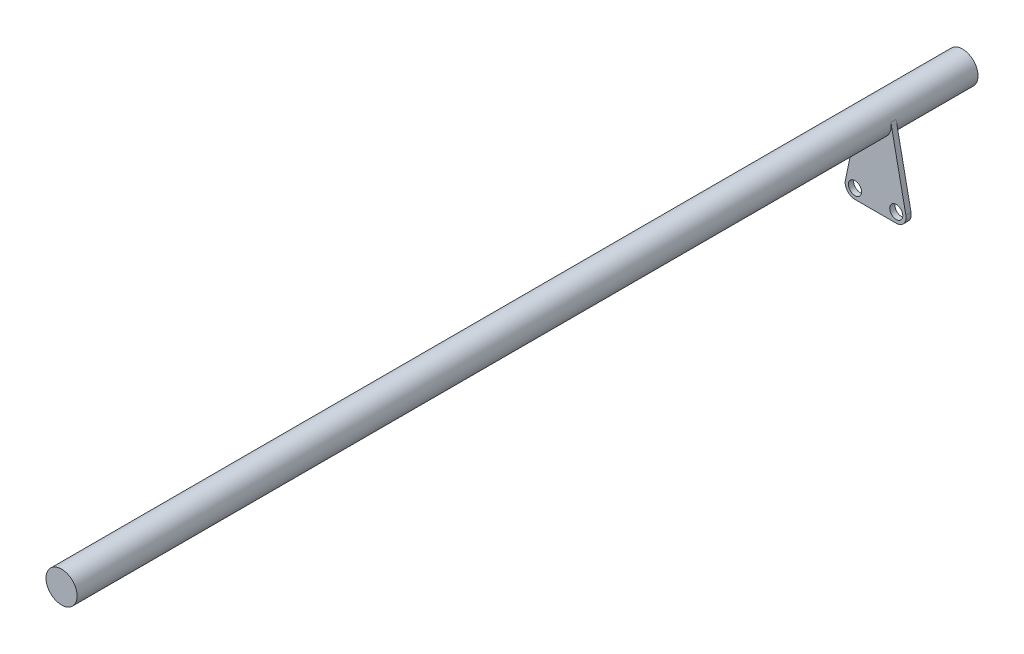
ISO-10303-21;
HEADER;
FILE_DESCRIPTION(('STEP AP214'),'2;1');
FILE_NAME('part.step','',(''),(''),'','','');
FILE_SCHEMA(('AUTOMOTIVE_DESIGN { 1 0 10303 214 1 1 1 1 }'));
ENDSEC;
DATA;
#1=APPLICATION_CONTEXT('core data for automotive mechanical design processes');
#2=APPLICATION_PROTOCOL_DEFINITION('international standard','automotive_design',2000,#1);
#3=PRODUCT_CONTEXT('',#1,'mechanical');
#4=PRODUCT('Part','Part','',(#3));
#5=PRODUCT_RELATED_PRODUCT_CATEGORY('part','',(#4));
#6=PRODUCT_DEFINITION_FORMATION('','',#4);
#7=PRODUCT_DEFINITION_CONTEXT('part definition',#1,'design');
#8=PRODUCT_DEFINITION('design','',#6,#7);
#9=PRODUCT_DEFINITION_SHAPE('','',#8);
#10=(LENGTH_UNIT() NAMED_UNIT(*) SI_UNIT(.MILLI.,.METRE.));
#11=(NAMED_UNIT(*) PLANE_ANGLE_UNIT() SI_UNIT($,.RADIAN.));
#12=(NAMED_UNIT(*) SI_UNIT($,.STERADIAN.) SOLID_ANGLE_UNIT());
#13=UNCERTAINTY_MEASURE_WITH_UNIT(LENGTH_MEASURE(1.E-05),#10,'distance_accuracy_value','');
#14=(GEOMETRIC_REPRESENTATION_CONTEXT(3) GLOBAL_UNCERTAINTY_ASSIGNED_CONTEXT((#13)) GLOBAL_UNIT_ASSIGNED_CONTEXT((#10,
#11,#12)) REPRESENTATION_CONTEXT('',''));
#15=CARTESIAN_POINT('',(0.,0.,0.));
#16=DIRECTION('',(0.,0.,1.));
#17=DIRECTION('',(1.,0.,0.));
#18=AXIS2_PLACEMENT_3D('',#15,#16,#17);
#19=CARTESIAN_POINT('',(0.,0.,250.));
#20=DIRECTION('',(0.,0.,-1.));
#21=DIRECTION('',(-1.,0.,0.));
#22=AXIS2_PLACEMENT_3D('',#19,#20,#21);
#23=CYLINDRICAL_SURFACE('',#22,9.525);
#24=DIRECTION('',(0.,0.,1.));
#25=VECTOR('',#24,1.);
#26=CARTESIAN_POINT('',(-9.32999835036764,1.91748684014706,-251.5875));
#27=LINE('',#26,#25);
#28=CARTESIAN_POINT('',(-9.32999835036764,1.91748684014706,-251.5875));
#29=VERTEX_POINT('',#28);
#30=CARTESIAN_POINT('',(-9.32999835036764,1.91748684014706,-248.4125));
#31=VERTEX_POINT('',#30);
#32=EDGE_CURVE('E86',#29,#31,#27,.T.);
#33=ORIENTED_EDGE('',*,*,#32,.T.);
#34=CARTESIAN_POINT('',(0.,0.,-248.4125));
#35=DIRECTION('',(0.,0.,-1.));
#36=DIRECTION('',(-1.,0.,0.));
#37=AXIS2_PLACEMENT_3D('',#34,#35,#36);
#38=CIRCLE('',#37,9.525);
#39=CARTESIAN_POINT('',(9.32999835036764,1.91748684014706,-248.4125));
#40=VERTEX_POINT('',#39);
#41=EDGE_CURVE('E42',#40,#31,#38,.T.);
#42=ORIENTED_EDGE('',*,*,#41,.F.);
#43=DIRECTION('',(0.,0.,1.));
#44=VECTOR('',#43,1.);
#45=CARTESIAN_POINT('',(9.32999835036764,1.91748684014706,-251.5875));
#46=LINE('',#45,#44);
#47=CARTESIAN_POINT('',(9.32999835036764,1.91748684014706,-251.5875));
#48=VERTEX_POINT('',#47);
#49=EDGE_CURVE('E141',#48,#40,#46,.T.);
#50=ORIENTED_EDGE('',*,*,#49,.F.);
#51=CARTESIAN_POINT('',(0.,0.,-251.5875));
#52=DIRECTION('',(0.,0.,-1.));
#53=DIRECTION('',(-1.,0.,0.));
#54=AXIS2_PLACEMENT_3D('',#51,#52,#53);
#55=CIRCLE('',#54,9.525);
#56=EDGE_CURVE('E11',#48,#29,#55,.T.);
#57=ORIENTED_EDGE('',*,*,#56,.T.);
#58=EDGE_LOOP('',(#33,#42,#50,#57));
#59=FACE_BOUND('',#58,.T.);
#60=CARTESIAN_POINT('',(0.,0.,250.));
#61=DIRECTION('',(0.,0.,1.));
#62=DIRECTION('',(1.,0.,0.));
#63=AXIS2_PLACEMENT_3D('',#60,#61,#62);
#64=CIRCLE('',#63,9.525);
#65=CARTESIAN_POINT('',(9.525,0.,250.));
#66=VERTEX_POINT('',#65);
#67=EDGE_CURVE('E142',#66,#66,#64,.T.);
#68=ORIENTED_EDGE('',*,*,#67,.F.);
#69=EDGE_LOOP('',(#68));
#70=FACE_BOUND('',#69,.T.);
#71=CARTESIAN_POINT('',(0.,0.,-301.5875));
#72=DIRECTION('',(0.,0.,-1.));
#73=DIRECTION('',(-1.,0.,0.));
#74=AXIS2_PLACEMENT_3D('',#71,#72,#73);
#75=CIRCLE('',#74,9.525);
#76=CARTESIAN_POINT('',(-9.525,0.,-301.5875));
#77=VERTEX_POINT('',#76);
#78=EDGE_CURVE('E175',#77,#77,#75,.T.);
#79=ORIENTED_EDGE('',*,*,#78,.F.);
#80=EDGE_LOOP('',(#79));
#81=FACE_BOUND('',#80,.T.);
#82=ADVANCED_FACE('F39',(#59,#70,#81),#23,.T.);
#83=CARTESIAN_POINT('',(0.,0.,250.));
#84=DIRECTION('',(0.,0.,1.));
#85=DIRECTION('',(1.,0.,0.));
#86=AXIS2_PLACEMENT_3D('',#83,#84,#85);
#87=PLANE('',#86);
#88=ORIENTED_EDGE('',*,*,#67,.T.);
#89=EDGE_LOOP('',(#88));
#90=FACE_BOUND('',#89,.T.);
#91=ADVANCED_FACE('F164',(#90),#87,.T.);
#92=CARTESIAN_POINT('',(9.32999835036764,1.91748684014706,-251.5875));
#93=DIRECTION('',(-0.979527385865369,-0.201310954346148,0.));
#94=DIRECTION('',(0.201310954346148,-0.979527385865369,0.));
#95=AXIS2_PLACEMENT_3D('',#92,#93,#94);
#96=PLANE('',#95);
#97=DIRECTION('',(0.201310954346148,-0.979527385865369,0.));
#98=VECTOR('',#97,1.);
#99=CARTESIAN_POINT('',(9.32999835036764,1.91748684014706,-248.4125));
#100=LINE('',#99,#98);
#101=CARTESIAN_POINT('',(18.5186505767437,-42.7921342739231,-248.4125));
#102=VERTEX_POINT('',#101);
#103=EDGE_CURVE('E126',#40,#102,#100,.T.);
#104=ORIENTED_EDGE('',*,*,#103,.T.);
#105=DIRECTION('',(0.,0.,1.));
#106=VECTOR('',#105,1.);
#107=CARTESIAN_POINT('',(18.5186505767437,-42.7921342739231,-251.5875));
#108=LINE('',#107,#106);
#109=CARTESIAN_POINT('',(18.5186505767437,-42.7921342739231,-251.5875));
#110=VERTEX_POINT('',#109);
#111=EDGE_CURVE('E116',#110,#102,#108,.T.);
#112=ORIENTED_EDGE('',*,*,#111,.F.);
#113=DIRECTION('',(0.201310954346148,-0.979527385865369,0.));
#114=VECTOR('',#113,1.);
#115=CARTESIAN_POINT('',(9.32999835036764,1.91748684014706,-251.5875));
#116=LINE('',#115,#114);
#117=EDGE_CURVE('E104',#48,#110,#116,.T.);
#118=ORIENTED_EDGE('',*,*,#117,.F.);
#119=ORIENTED_EDGE('',*,*,#49,.T.);
#120=EDGE_LOOP('',(#104,#112,#118,#119));
#121=FACE_BOUND('',#120,.T.);
#122=ADVANCED_FACE('F170',(#121),#96,.F.);
#123=CARTESIAN_POINT('',(12.6414862615515,-44.,-251.5875));
#124=DIRECTION('',(0.,0.,1.));
#125=DIRECTION('',(1.,0.,0.));
#126=AXIS2_PLACEMENT_3D('',#123,#124,#125);
#127=CYLINDRICAL_SURFACE('',#126,6.);
#128=CARTESIAN_POINT('',(12.6414862615515,-44.,-248.4125));
#129=DIRECTION('',(0.,0.,-1.));
#130=DIRECTION('',(-1.,0.,0.));
#131=AXIS2_PLACEMENT_3D('',#128,#129,#130);
#132=CIRCLE('',#131,6.);
#133=CARTESIAN_POINT('',(12.6414862615515,-50.,-248.4125));
#134=VERTEX_POINT('',#133);
#135=EDGE_CURVE('E113',#102,#134,#132,.T.);
#136=ORIENTED_EDGE('',*,*,#135,.T.);
#137=DIRECTION('',(0.,0.,1.));
#138=VECTOR('',#137,1.);
#139=CARTESIAN_POINT('',(12.6414862615515,-50.,-251.5875));
#140=LINE('',#139,#138);
#141=CARTESIAN_POINT('',(12.6414862615515,-50.,-251.5875));
#142=VERTEX_POINT('',#141);
#143=EDGE_CURVE('E110',#142,#134,#140,.T.);
#144=ORIENTED_EDGE('',*,*,#143,.F.);
#145=CARTESIAN_POINT('',(12.6414862615515,-44.,-251.5875));
#146=DIRECTION('',(0.,0.,-1.));
#147=DIRECTION('',(-1.,0.,0.));
#148=AXIS2_PLACEMENT_3D('',#145,#146,#147);
#149=CIRCLE('',#148,6.);
#150=EDGE_CURVE('E97',#110,#142,#149,.T.);
#151=ORIENTED_EDGE('',*,*,#150,.F.);
#152=ORIENTED_EDGE('',*,*,#111,.T.);
#153=EDGE_LOOP('',(#136,#144,#151,#152));
#154=FACE_BOUND('',#153,.T.);
#155=ADVANCED_FACE('F111',(#154),#127,.T.);
#156=CARTESIAN_POINT('',(12.6414862615515,-50.,-251.5875));
#157=DIRECTION('',(0.,1.,0.));
#158=DIRECTION('',(0.,0.,1.));
#159=AXIS2_PLACEMENT_3D('',#156,#157,#158);
#160=PLANE('',#159);
#161=DIRECTION('',(-1.,0.,0.));
#162=VECTOR('',#161,1.);
#163=CARTESIAN_POINT('',(12.6414862615515,-50.,-248.4125));
#164=LINE('',#163,#162);
#165=CARTESIAN_POINT('',(-12.6414862615515,-50.,-248.4125));
#166=VERTEX_POINT('',#165);
#167=EDGE_CURVE('E130',#134,#166,#164,.T.);
#168=ORIENTED_EDGE('',*,*,#167,.T.);
#169=DIRECTION('',(0.,0.,1.));
#170=VECTOR('',#169,1.);
#171=CARTESIAN_POINT('',(-12.6414862615515,-50.,-251.5875));
#172=LINE('',#171,#170);
#173=CARTESIAN_POINT('',(-12.6414862615515,-50.,-251.5875));
#174=VERTEX_POINT('',#173);
#175=EDGE_CURVE('E117',#174,#166,#172,.T.);
#176=ORIENTED_EDGE('',*,*,#175,.F.);
#177=DIRECTION('',(-1.,0.,0.));
#178=VECTOR('',#177,1.);
#179=CARTESIAN_POINT('',(12.6414862615515,-50.,-251.5875));
#180=LINE('',#179,#178);
#181=EDGE_CURVE('E102',#142,#174,#180,.T.);
#182=ORIENTED_EDGE('',*,*,#181,.F.);
#183=ORIENTED_EDGE('',*,*,#143,.T.);
#184=EDGE_LOOP('',(#168,#176,#182,#183));
#185=FACE_BOUND('',#184,.T.);
#186=ADVANCED_FACE('F119',(#185),#160,.F.);
#187=CARTESIAN_POINT('',(-12.6414862615515,-44.,-251.5875));
#188=DIRECTION('',(0.,0.,1.));
#189=DIRECTION('',(1.,0.,0.));
#190=AXIS2_PLACEMENT_3D('',#187,#188,#189);
#191=CYLINDRICAL_SURFACE('',#190,6.);
#192=CARTESIAN_POINT('',(-12.6414862615515,-44.,-248.4125));
#193=DIRECTION('',(0.,0.,-1.));
#194=DIRECTION('',(-1.,0.,0.));
#195=AXIS2_PLACEMENT_3D('',#192,#193,#194);
#196=CIRCLE('',#195,6.);
#197=CARTESIAN_POINT('',(-18.5186505767437,-42.7921342739231,-248.4125));
#198=VERTEX_POINT('',#197);
#199=EDGE_CURVE('E79',#166,#198,#196,.T.);
#200=ORIENTED_EDGE('',*,*,#199,.T.);
#201=DIRECTION('',(0.,0.,1.));
#202=VECTOR('',#201,1.);
#203=CARTESIAN_POINT('',(-18.5186505767437,-42.7921342739231,-251.5875));
#204=LINE('',#203,#202);
#205=CARTESIAN_POINT('',(-18.5186505767437,-42.7921342739231,-251.5875));
#206=VERTEX_POINT('',#205);
#207=EDGE_CURVE('E137',#206,#198,#204,.T.);
#208=ORIENTED_EDGE('',*,*,#207,.F.);
#209=CARTESIAN_POINT('',(-12.6414862615515,-44.,-251.5875));
#210=DIRECTION('',(0.,0.,-1.));
#211=DIRECTION('',(-1.,0.,0.));
#212=AXIS2_PLACEMENT_3D('',#209,#210,#211);
#213=CIRCLE('',#212,6.);
#214=EDGE_CURVE('E56',#174,#206,#213,.T.);
#215=ORIENTED_EDGE('',*,*,#214,.F.);
#216=ORIENTED_EDGE('',*,*,#175,.T.);
#217=EDGE_LOOP('',(#200,#208,#215,#216));
#218=FACE_BOUND('',#217,.T.);
#219=ADVANCED_FACE('F154',(#218),#191,.T.);
#220=CARTESIAN_POINT('',(-18.5186505767437,-42.7921342739231,-251.5875));
#221=DIRECTION('',(0.979527385865369,-0.201310954346147,0.));
#222=DIRECTION('',(0.201310954346148,0.979527385865369,0.));
#223=AXIS2_PLACEMENT_3D('',#220,#221,#222);
#224=PLANE('',#223);
#225=DIRECTION('',(0.201310954346148,0.979527385865369,0.));
#226=VECTOR('',#225,1.);
#227=CARTESIAN_POINT('',(-18.5186505767437,-42.7921342739231,-248.4125));
#228=LINE('',#227,#226);
#229=EDGE_CURVE('E133',#198,#31,#228,.T.);
#230=ORIENTED_EDGE('',*,*,#229,.T.);
#231=ORIENTED_EDGE('',*,*,#32,.F.);
#232=DIRECTION('',(0.201310954346148,0.979527385865369,0.));
#233=VECTOR('',#232,1.);
#234=CARTESIAN_POINT('',(-18.5186505767437,-42.7921342739231,-251.5875));
#235=LINE('',#234,#233);
#236=EDGE_CURVE('E121',#206,#29,#235,.T.);
#237=ORIENTED_EDGE('',*,*,#236,.F.);
#238=ORIENTED_EDGE('',*,*,#207,.T.);
#239=EDGE_LOOP('',(#230,#231,#237,#238));
#240=FACE_BOUND('',#239,.T.);
#241=ADVANCED_FACE('F152',(#240),#224,.F.);
#242=CARTESIAN_POINT('',(0.,0.,-251.5875));
#243=DIRECTION('',(0.,0.,-1.));
#244=DIRECTION('',(-1.,0.,0.));
#245=AXIS2_PLACEMENT_3D('',#242,#243,#244);
#246=PLANE('',#245);
#247=ORIENTED_EDGE('',*,*,#56,.F.);
#248=ORIENTED_EDGE('',*,*,#117,.T.);
#249=ORIENTED_EDGE('',*,*,#150,.T.);
#250=ORIENTED_EDGE('',*,*,#181,.T.);
#251=ORIENTED_EDGE('',*,*,#214,.T.);
#252=ORIENTED_EDGE('',*,*,#236,.T.);
#253=EDGE_LOOP('',(#247,#248,#249,#250,#251,#252));
#254=FACE_BOUND('',#253,.T.);
#255=CARTESIAN_POINT('',(-12.6414862615515,-44.,-251.5875));
#256=DIRECTION('',(0.,0.,-1.));
#257=DIRECTION('',(-1.,0.,0.));
#258=AXIS2_PLACEMENT_3D('',#255,#256,#257);
#259=CIRCLE('',#258,4.00000000000001);
#260=CARTESIAN_POINT('',(-16.6414862615515,-44.,-251.5875));
#261=VERTEX_POINT('',#260);
#262=EDGE_CURVE('E185',#261,#261,#259,.F.);
#263=ORIENTED_EDGE('',*,*,#262,.T.);
#264=EDGE_LOOP('',(#263));
#265=FACE_BOUND('',#264,.T.);
#266=CARTESIAN_POINT('',(12.6414862615515,-44.,-251.5875));
#267=DIRECTION('',(0.,0.,-1.));
#268=DIRECTION('',(-1.,0.,0.));
#269=AXIS2_PLACEMENT_3D('',#266,#267,#268);
#270=CIRCLE('',#269,4.);
#271=CARTESIAN_POINT('',(8.64148626155148,-44.,-251.5875));
#272=VERTEX_POINT('',#271);
#273=EDGE_CURVE('E180',#272,#272,#270,.F.);
#274=ORIENTED_EDGE('',*,*,#273,.T.);
#275=EDGE_LOOP('',(#274));
#276=FACE_BOUND('',#275,.T.);
#277=ADVANCED_FACE('F99',(#254,#265,#276),#246,.T.);
#278=CARTESIAN_POINT('',(0.,0.,-248.4125));
#279=DIRECTION('',(0.,0.,-1.));
#280=DIRECTION('',(-1.,0.,0.));
#281=AXIS2_PLACEMENT_3D('',#278,#279,#280);
#282=PLANE('',#281);
#283=CARTESIAN_POINT('',(-12.6414862615515,-44.,-248.4125));
#284=DIRECTION('',(0.,0.,1.));
#285=DIRECTION('',(1.,0.,0.));
#286=AXIS2_PLACEMENT_3D('',#283,#284,#285);
#287=CIRCLE('',#286,4.00000000000001);
#288=CARTESIAN_POINT('',(-8.64148626155147,-44.,-248.4125));
#289=VERTEX_POINT('',#288);
#290=EDGE_CURVE('E128',#289,#289,#287,.T.);
#291=ORIENTED_EDGE('',*,*,#290,.F.);
#292=EDGE_LOOP('',(#291));
#293=FACE_BOUND('',#292,.T.);
#294=CARTESIAN_POINT('',(12.6414862615515,-44.,-248.4125));
#295=DIRECTION('',(0.,0.,1.));
#296=DIRECTION('',(1.,0.,0.));
#297=AXIS2_PLACEMENT_3D('',#294,#295,#296);
#298=CIRCLE('',#297,4.);
#299=CARTESIAN_POINT('',(16.6414862615515,-44.,-248.4125));
#300=VERTEX_POINT('',#299);
#301=EDGE_CURVE('E177',#300,#300,#298,.T.);
#302=ORIENTED_EDGE('',*,*,#301,.F.);
#303=EDGE_LOOP('',(#302));
#304=FACE_BOUND('',#303,.T.);
#305=ORIENTED_EDGE('',*,*,#103,.F.);
#306=ORIENTED_EDGE('',*,*,#41,.T.);
#307=ORIENTED_EDGE('',*,*,#229,.F.);
#308=ORIENTED_EDGE('',*,*,#199,.F.);
#309=ORIENTED_EDGE('',*,*,#167,.F.);
#310=ORIENTED_EDGE('',*,*,#135,.F.);
#311=EDGE_LOOP('',(#305,#306,#307,#308,#309,#310));
#312=FACE_BOUND('',#311,.T.);
#313=ADVANCED_FACE('F149',(#293,#304,#312),#282,.F.);
#314=CARTESIAN_POINT('',(12.6414862615515,-44.,-251.5885));
#315=DIRECTION('',(0.,0.,1.));
#316=DIRECTION('',(1.,0.,0.));
#317=AXIS2_PLACEMENT_3D('',#314,#315,#316);
#318=CYLINDRICAL_SURFACE('',#317,4.);
#319=ORIENTED_EDGE('',*,*,#273,.F.);
#320=EDGE_LOOP('',(#319));
#321=FACE_BOUND('',#320,.T.);
#322=ORIENTED_EDGE('',*,*,#301,.T.);
#323=EDGE_LOOP('',(#322));
#324=FACE_BOUND('',#323,.T.);
#325=ADVANCED_FACE('F192',(#321,#324),#318,.F.);
#326=CARTESIAN_POINT('',(-12.6414862615515,-44.,-251.5885));
#327=DIRECTION('',(0.,0.,1.));
#328=DIRECTION('',(1.,0.,0.));
#329=AXIS2_PLACEMENT_3D('',#326,#327,#328);
#330=CYLINDRICAL_SURFACE('',#329,4.00000000000001);
#331=ORIENTED_EDGE('',*,*,#262,.F.);
#332=EDGE_LOOP('',(#331));
#333=FACE_BOUND('',#332,.T.);
#334=ORIENTED_EDGE('',*,*,#290,.T.);
#335=EDGE_LOOP('',(#334));
#336=FACE_BOUND('',#335,.T.);
#337=ADVANCED_FACE('F195',(#333,#336),#330,.F.);
#338=CARTESIAN_POINT('',(0.,0.,-301.5875));
#339=DIRECTION('',(0.,0.,-1.));
#340=DIRECTION('',(-1.,0.,0.));
#341=AXIS2_PLACEMENT_3D('',#338,#339,#340);
#342=PLANE('',#341);
#343=ORIENTED_EDGE('',*,*,#78,.T.);
#344=EDGE_LOOP('',(#343));
#345=FACE_BOUND('',#344,.T.);
#346=ADVANCED_FACE('F209',(#345),#342,.T.);
#347=CLOSED_SHELL('',(#82,#91,#122,#155,#186,#219,#241,#277,#313,#325,#337,#346));
#348=MANIFOLD_SOLID_BREP('B2',#347);
#349=ADVANCED_BREP_SHAPE_REPRESENTATION('',(#18,#348),#14);
#350=SHAPE_DEFINITION_REPRESENTATION(#9,#349);
ENDSEC;
END-ISO-10303-21;
